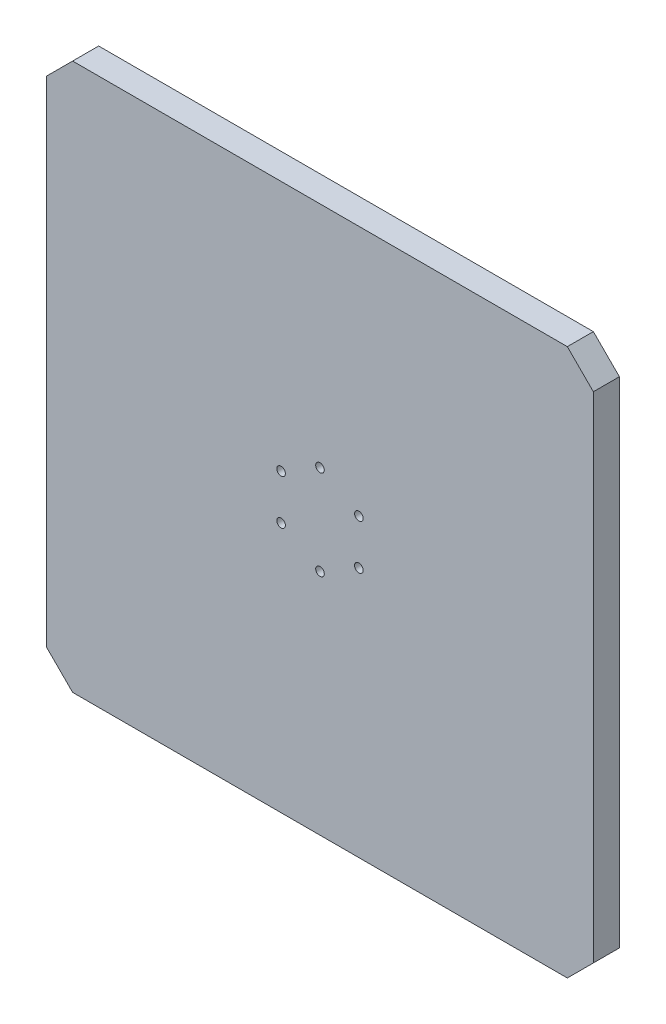
ISO-10303-21;
HEADER;
FILE_DESCRIPTION(('STEP AP214'),'2;1');
FILE_NAME('part.step','',(''),(''),'','','');
FILE_SCHEMA(('AUTOMOTIVE_DESIGN { 1 0 10303 214 1 1 1 1 }'));
ENDSEC;
DATA;
#1=APPLICATION_CONTEXT('core data for automotive mechanical design processes');
#2=APPLICATION_PROTOCOL_DEFINITION('international standard','automotive_design',2000,#1);
#3=PRODUCT_CONTEXT('',#1,'mechanical');
#4=PRODUCT('Part','Part','',(#3));
#5=PRODUCT_RELATED_PRODUCT_CATEGORY('part','',(#4));
#6=PRODUCT_DEFINITION_FORMATION('','',#4);
#7=PRODUCT_DEFINITION_CONTEXT('part definition',#1,'design');
#8=PRODUCT_DEFINITION('design','',#6,#7);
#9=PRODUCT_DEFINITION_SHAPE('','',#8);
#10=(LENGTH_UNIT() NAMED_UNIT(*) SI_UNIT(.MILLI.,.METRE.));
#11=(NAMED_UNIT(*) PLANE_ANGLE_UNIT() SI_UNIT($,.RADIAN.));
#12=(NAMED_UNIT(*) SI_UNIT($,.STERADIAN.) SOLID_ANGLE_UNIT());
#13=UNCERTAINTY_MEASURE_WITH_UNIT(LENGTH_MEASURE(1.E-05),#10,'distance_accuracy_value','');
#14=(GEOMETRIC_REPRESENTATION_CONTEXT(3) GLOBAL_UNCERTAINTY_ASSIGNED_CONTEXT((#13)) GLOBAL_UNIT_ASSIGNED_CONTEXT((#10,
#11,#12)) REPRESENTATION_CONTEXT('',''));
#15=CARTESIAN_POINT('',(0.,0.,0.));
#16=DIRECTION('',(0.,0.,1.));
#17=DIRECTION('',(1.,0.,0.));
#18=AXIS2_PLACEMENT_3D('',#15,#16,#17);
#19=CARTESIAN_POINT('',(0.,105.,0.));
#20=DIRECTION('',(0.,1.,0.));
#21=DIRECTION('',(0.,0.,1.));
#22=AXIS2_PLACEMENT_3D('',#19,#20,#21);
#23=PLANE('',#22);
#24=DIRECTION('',(0.,0.,-1.));
#25=VECTOR('',#24,1.);
#26=CARTESIAN_POINT('',(95.,105.,0.));
#27=LINE('',#26,#25);
#28=CARTESIAN_POINT('',(95.,105.,30.));
#29=VERTEX_POINT('',#28);
#30=CARTESIAN_POINT('',(95.,105.,20.));
#31=VERTEX_POINT('',#30);
#32=EDGE_CURVE('E56',#29,#31,#27,.T.);
#33=ORIENTED_EDGE('',*,*,#32,.T.);
#34=DIRECTION('',(1.,0.,0.));
#35=VECTOR('',#34,1.);
#36=CARTESIAN_POINT('',(-95.,105.,20.));
#37=LINE('',#36,#35);
#38=CARTESIAN_POINT('',(-95.,105.,20.));
#39=VERTEX_POINT('',#38);
#40=EDGE_CURVE('E63',#39,#31,#37,.T.);
#41=ORIENTED_EDGE('',*,*,#40,.F.);
#42=DIRECTION('',(0.,0.,1.));
#43=VECTOR('',#42,1.);
#44=CARTESIAN_POINT('',(-95.,105.,0.));
#45=LINE('',#44,#43);
#46=CARTESIAN_POINT('',(-95.,105.,30.));
#47=VERTEX_POINT('',#46);
#48=EDGE_CURVE('E11',#39,#47,#45,.T.);
#49=ORIENTED_EDGE('',*,*,#48,.T.);
#50=DIRECTION('',(1.,0.,0.));
#51=VECTOR('',#50,1.);
#52=CARTESIAN_POINT('',(-75.,105.,30.));
#53=LINE('',#52,#51);
#54=EDGE_CURVE('E157',#47,#29,#53,.T.);
#55=ORIENTED_EDGE('',*,*,#54,.T.);
#56=EDGE_LOOP('',(#33,#41,#49,#55));
#57=FACE_BOUND('',#56,.T.);
#58=ADVANCED_FACE('F46',(#57),#23,.T.);
#59=CARTESIAN_POINT('',(-105.,0.,0.));
#60=DIRECTION('',(-1.,0.,0.));
#61=DIRECTION('',(0.,0.,1.));
#62=AXIS2_PLACEMENT_3D('',#59,#60,#61);
#63=PLANE('',#62);
#64=DIRECTION('',(0.,0.,-1.));
#65=VECTOR('',#64,1.);
#66=CARTESIAN_POINT('',(-105.,95.0000000000001,0.));
#67=LINE('',#66,#65);
#68=CARTESIAN_POINT('',(-105.,95.,30.));
#69=VERTEX_POINT('',#68);
#70=CARTESIAN_POINT('',(-105.,95.0000000000001,20.));
#71=VERTEX_POINT('',#70);
#72=EDGE_CURVE('E150',#69,#71,#67,.T.);
#73=ORIENTED_EDGE('',*,*,#72,.T.);
#74=DIRECTION('',(0.,1.,0.));
#75=VECTOR('',#74,1.);
#76=CARTESIAN_POINT('',(-105.,-94.9999999999999,20.));
#77=LINE('',#76,#75);
#78=CARTESIAN_POINT('',(-105.,-94.9999999999999,20.));
#79=VERTEX_POINT('',#78);
#80=EDGE_CURVE('E206',#79,#71,#77,.T.);
#81=ORIENTED_EDGE('',*,*,#80,.F.);
#82=DIRECTION('',(0.,0.,1.));
#83=VECTOR('',#82,1.);
#84=CARTESIAN_POINT('',(-105.,-95.,0.));
#85=LINE('',#84,#83);
#86=CARTESIAN_POINT('',(-105.,-95.,30.));
#87=VERTEX_POINT('',#86);
#88=EDGE_CURVE('E148',#79,#87,#85,.T.);
#89=ORIENTED_EDGE('',*,*,#88,.T.);
#90=DIRECTION('',(0.,1.,0.));
#91=VECTOR('',#90,1.);
#92=CARTESIAN_POINT('',(-105.,-75.,30.));
#93=LINE('',#92,#91);
#94=EDGE_CURVE('E159',#87,#69,#93,.T.);
#95=ORIENTED_EDGE('',*,*,#94,.T.);
#96=EDGE_LOOP('',(#73,#81,#89,#95));
#97=FACE_BOUND('',#96,.T.);
#98=ADVANCED_FACE('F227',(#97),#63,.T.);
#99=CARTESIAN_POINT('',(0.,-105.,0.));
#100=DIRECTION('',(0.,-1.,0.));
#101=DIRECTION('',(0.,0.,-1.));
#102=AXIS2_PLACEMENT_3D('',#99,#100,#101);
#103=PLANE('',#102);
#104=DIRECTION('',(0.,0.,-1.));
#105=VECTOR('',#104,1.);
#106=CARTESIAN_POINT('',(-95.0000000000001,-105.,0.));
#107=LINE('',#106,#105);
#108=CARTESIAN_POINT('',(-95.,-105.,30.));
#109=VERTEX_POINT('',#108);
#110=CARTESIAN_POINT('',(-95.0000000000001,-105.,20.));
#111=VERTEX_POINT('',#110);
#112=EDGE_CURVE('E153',#109,#111,#107,.T.);
#113=ORIENTED_EDGE('',*,*,#112,.T.);
#114=DIRECTION('',(-1.,0.,0.));
#115=VECTOR('',#114,1.);
#116=CARTESIAN_POINT('',(94.9999999999999,-105.,20.));
#117=LINE('',#116,#115);
#118=CARTESIAN_POINT('',(94.9999999999999,-105.,20.));
#119=VERTEX_POINT('',#118);
#120=EDGE_CURVE('E130',#119,#111,#117,.T.);
#121=ORIENTED_EDGE('',*,*,#120,.F.);
#122=DIRECTION('',(0.,0.,1.));
#123=VECTOR('',#122,1.);
#124=CARTESIAN_POINT('',(95.,-105.,0.));
#125=LINE('',#124,#123);
#126=CARTESIAN_POINT('',(95.,-105.,30.));
#127=VERTEX_POINT('',#126);
#128=EDGE_CURVE('E129',#119,#127,#125,.T.);
#129=ORIENTED_EDGE('',*,*,#128,.T.);
#130=DIRECTION('',(-1.,0.,0.));
#131=VECTOR('',#130,1.);
#132=CARTESIAN_POINT('',(75.,-105.,30.));
#133=LINE('',#132,#131);
#134=EDGE_CURVE('E162',#127,#109,#133,.T.);
#135=ORIENTED_EDGE('',*,*,#134,.T.);
#136=EDGE_LOOP('',(#113,#121,#129,#135));
#137=FACE_BOUND('',#136,.T.);
#138=ADVANCED_FACE('F233',(#137),#103,.T.);
#139=CARTESIAN_POINT('',(105.,0.,0.));
#140=DIRECTION('',(1.,0.,0.));
#141=DIRECTION('',(0.,0.,-1.));
#142=AXIS2_PLACEMENT_3D('',#139,#140,#141);
#143=PLANE('',#142);
#144=DIRECTION('',(0.,0.,-1.));
#145=VECTOR('',#144,1.);
#146=CARTESIAN_POINT('',(105.,-95.0000000000001,0.));
#147=LINE('',#146,#145);
#148=CARTESIAN_POINT('',(105.,-95.0000000000001,30.));
#149=VERTEX_POINT('',#148);
#150=CARTESIAN_POINT('',(105.,-95.0000000000001,20.));
#151=VERTEX_POINT('',#150);
#152=EDGE_CURVE('E128',#149,#151,#147,.T.);
#153=ORIENTED_EDGE('',*,*,#152,.T.);
#154=DIRECTION('',(0.,-1.,0.));
#155=VECTOR('',#154,1.);
#156=CARTESIAN_POINT('',(105.,95.0000000000001,20.));
#157=LINE('',#156,#155);
#158=CARTESIAN_POINT('',(105.,95.0000000000001,20.));
#159=VERTEX_POINT('',#158);
#160=EDGE_CURVE('E112',#159,#151,#157,.T.);
#161=ORIENTED_EDGE('',*,*,#160,.F.);
#162=DIRECTION('',(0.,0.,1.));
#163=VECTOR('',#162,1.);
#164=CARTESIAN_POINT('',(105.,95.0000000000001,0.));
#165=LINE('',#164,#163);
#166=CARTESIAN_POINT('',(105.,95.0000000000001,30.));
#167=VERTEX_POINT('',#166);
#168=EDGE_CURVE('E135',#159,#167,#165,.T.);
#169=ORIENTED_EDGE('',*,*,#168,.T.);
#170=DIRECTION('',(0.,-1.,0.));
#171=VECTOR('',#170,1.);
#172=CARTESIAN_POINT('',(105.,105.,30.));
#173=LINE('',#172,#171);
#174=EDGE_CURVE('E134',#167,#149,#173,.T.);
#175=ORIENTED_EDGE('',*,*,#174,.T.);
#176=EDGE_LOOP('',(#153,#161,#169,#175));
#177=FACE_BOUND('',#176,.T.);
#178=ADVANCED_FACE('F133',(#177),#143,.T.);
#179=CARTESIAN_POINT('',(-95.0000000000001,-105.,0.));
#180=DIRECTION('',(0.707106781186549,0.707106781186546,0.));
#181=DIRECTION('',(0.,0.,-1.));
#182=AXIS2_PLACEMENT_3D('',#179,#180,#181);
#183=PLANE('',#182);
#184=ORIENTED_EDGE('',*,*,#88,.F.);
#185=DIRECTION('',(-0.707106781186544,0.707106781186551,0.));
#186=VECTOR('',#185,1.);
#187=CARTESIAN_POINT('',(-95.0000000000001,-105.,20.));
#188=LINE('',#187,#186);
#189=EDGE_CURVE('E208',#111,#79,#188,.T.);
#190=ORIENTED_EDGE('',*,*,#189,.F.);
#191=ORIENTED_EDGE('',*,*,#112,.F.);
#192=DIRECTION('',(-0.707106781186546,0.707106781186549,0.));
#193=VECTOR('',#192,1.);
#194=CARTESIAN_POINT('',(-95.0000000000001,-105.,30.));
#195=LINE('',#194,#193);
#196=EDGE_CURVE('E139',#87,#109,#195,.F.);
#197=ORIENTED_EDGE('',*,*,#196,.F.);
#198=EDGE_LOOP('',(#184,#190,#191,#197));
#199=FACE_BOUND('',#198,.T.);
#200=ADVANCED_FACE('F246',(#199),#183,.F.);
#201=CARTESIAN_POINT('',(105.,-95.0000000000001,0.));
#202=DIRECTION('',(-0.707106781186546,0.707106781186549,0.));
#203=DIRECTION('',(0.,0.,-1.));
#204=AXIS2_PLACEMENT_3D('',#201,#202,#203);
#205=PLANE('',#204);
#206=ORIENTED_EDGE('',*,*,#128,.F.);
#207=DIRECTION('',(-0.707106781186551,-0.707106781186544,0.));
#208=VECTOR('',#207,1.);
#209=CARTESIAN_POINT('',(105.,-95.0000000000001,20.));
#210=LINE('',#209,#208);
#211=EDGE_CURVE('E115',#151,#119,#210,.T.);
#212=ORIENTED_EDGE('',*,*,#211,.F.);
#213=ORIENTED_EDGE('',*,*,#152,.F.);
#214=DIRECTION('',(-0.707106781186549,-0.707106781186546,0.));
#215=VECTOR('',#214,1.);
#216=CARTESIAN_POINT('',(105.,-95.0000000000001,30.));
#217=LINE('',#216,#215);
#218=EDGE_CURVE('E143',#127,#149,#217,.F.);
#219=ORIENTED_EDGE('',*,*,#218,.F.);
#220=EDGE_LOOP('',(#206,#212,#213,#219));
#221=FACE_BOUND('',#220,.T.);
#222=ADVANCED_FACE('F126',(#221),#205,.F.);
#223=CARTESIAN_POINT('',(-105.,95.0000000000001,0.));
#224=DIRECTION('',(0.707106781186546,-0.707106781186549,0.));
#225=DIRECTION('',(0.,0.,-1.));
#226=AXIS2_PLACEMENT_3D('',#223,#224,#225);
#227=PLANE('',#226);
#228=ORIENTED_EDGE('',*,*,#48,.F.);
#229=DIRECTION('',(0.707106781186549,0.707106781186546,0.));
#230=VECTOR('',#229,1.);
#231=CARTESIAN_POINT('',(-105.,95.0000000000001,20.));
#232=LINE('',#231,#230);
#233=EDGE_CURVE('E204',#71,#39,#232,.T.);
#234=ORIENTED_EDGE('',*,*,#233,.F.);
#235=ORIENTED_EDGE('',*,*,#72,.F.);
#236=DIRECTION('',(0.707106781186549,0.707106781186546,0.));
#237=VECTOR('',#236,1.);
#238=CARTESIAN_POINT('',(-105.,95.0000000000001,30.));
#239=LINE('',#238,#237);
#240=EDGE_CURVE('E145',#47,#69,#239,.F.);
#241=ORIENTED_EDGE('',*,*,#240,.F.);
#242=EDGE_LOOP('',(#228,#234,#235,#241));
#243=FACE_BOUND('',#242,.T.);
#244=ADVANCED_FACE('F257',(#243),#227,.F.);
#245=CARTESIAN_POINT('',(105.,95.0000000000001,0.));
#246=DIRECTION('',(-0.707106781186546,-0.707106781186549,0.));
#247=DIRECTION('',(0.,0.,1.));
#248=AXIS2_PLACEMENT_3D('',#245,#246,#247);
#249=PLANE('',#248);
#250=ORIENTED_EDGE('',*,*,#168,.F.);
#251=DIRECTION('',(0.707106781186549,-0.707106781186546,0.));
#252=VECTOR('',#251,1.);
#253=CARTESIAN_POINT('',(95.,105.,20.));
#254=LINE('',#253,#252);
#255=EDGE_CURVE('E117',#31,#159,#254,.T.);
#256=ORIENTED_EDGE('',*,*,#255,.F.);
#257=ORIENTED_EDGE('',*,*,#32,.F.);
#258=DIRECTION('',(0.707106781186549,-0.707106781186546,0.));
#259=VECTOR('',#258,1.);
#260=CARTESIAN_POINT('',(105.,95.0000000000001,30.));
#261=LINE('',#260,#259);
#262=EDGE_CURVE('E71',#167,#29,#261,.F.);
#263=ORIENTED_EDGE('',*,*,#262,.F.);
#264=EDGE_LOOP('',(#250,#256,#257,#263));
#265=FACE_BOUND('',#264,.T.);
#266=ADVANCED_FACE('F49',(#265),#249,.F.);
#267=CARTESIAN_POINT('',(0.,0.,-10.));
#268=DIRECTION('',(0.,0.,1.));
#269=DIRECTION('',(1.,0.,0.));
#270=AXIS2_PLACEMENT_3D('',#267,#268,#269);
#271=CYLINDRICAL_SURFACE('',#270,48.25);
#272=CARTESIAN_POINT('',(0.,0.,10.));
#273=DIRECTION('',(0.,0.,-1.));
#274=DIRECTION('',(-1.,0.,0.));
#275=AXIS2_PLACEMENT_3D('',#272,#273,#274);
#276=CIRCLE('',#275,48.25);
#277=CARTESIAN_POINT('',(-48.25,0.,10.));
#278=VERTEX_POINT('',#277);
#279=EDGE_CURVE('E199',#278,#278,#276,.T.);
#280=ORIENTED_EDGE('',*,*,#279,.F.);
#281=EDGE_LOOP('',(#280));
#282=FACE_BOUND('',#281,.T.);
#283=CARTESIAN_POINT('',(0.,0.,20.));
#284=DIRECTION('',(0.,0.,-1.));
#285=DIRECTION('',(-1.,0.,0.));
#286=AXIS2_PLACEMENT_3D('',#283,#284,#285);
#287=CIRCLE('',#286,48.25);
#288=CARTESIAN_POINT('',(-48.25,0.,20.));
#289=VERTEX_POINT('',#288);
#290=EDGE_CURVE('E121',#289,#289,#287,.T.);
#291=ORIENTED_EDGE('',*,*,#290,.T.);
#292=EDGE_LOOP('',(#291));
#293=FACE_BOUND('',#292,.T.);
#294=ADVANCED_FACE('F214',(#282,#293),#271,.T.);
#295=CARTESIAN_POINT('',(14.9389382152816,-8.62499999999986,30.));
#296=DIRECTION('',(0.,0.,-1.));
#297=DIRECTION('',(-1.,0.,0.));
#298=AXIS2_PLACEMENT_3D('',#295,#296,#297);
#299=CYLINDRICAL_SURFACE('',#298,1.65);
#300=CARTESIAN_POINT('',(14.9389382152816,-8.62499999999986,30.));
#301=DIRECTION('',(0.,0.,-1.));
#302=DIRECTION('',(-1.,0.,0.));
#303=AXIS2_PLACEMENT_3D('',#300,#301,#302);
#304=CIRCLE('',#303,1.65);
#305=CARTESIAN_POINT('',(13.2889382152816,-8.62499999999986,30.));
#306=VERTEX_POINT('',#305);
#307=EDGE_CURVE('E166',#306,#306,#304,.T.);
#308=ORIENTED_EDGE('',*,*,#307,.F.);
#309=EDGE_LOOP('',(#308));
#310=FACE_BOUND('',#309,.T.);
#311=CARTESIAN_POINT('',(14.9389382152816,-8.62499999999986,10.));
#312=DIRECTION('',(0.,0.,-1.));
#313=DIRECTION('',(-1.,0.,0.));
#314=AXIS2_PLACEMENT_3D('',#311,#312,#313);
#315=CIRCLE('',#314,1.65);
#316=CARTESIAN_POINT('',(13.2889382152816,-8.62499999999986,10.));
#317=VERTEX_POINT('',#316);
#318=EDGE_CURVE('E174',#317,#317,#315,.F.);
#319=ORIENTED_EDGE('',*,*,#318,.F.);
#320=EDGE_LOOP('',(#319));
#321=FACE_BOUND('',#320,.T.);
#322=ADVANCED_FACE('F239',(#310,#321),#299,.F.);
#323=CARTESIAN_POINT('',(1.20456106190088E-13,-17.25,30.));
#324=DIRECTION('',(0.,0.,-1.));
#325=DIRECTION('',(-1.,0.,0.));
#326=AXIS2_PLACEMENT_3D('',#323,#324,#325);
#327=CYLINDRICAL_SURFACE('',#326,1.65);
#328=CARTESIAN_POINT('',(1.20456106190088E-13,-17.25,30.));
#329=DIRECTION('',(0.,0.,-1.));
#330=DIRECTION('',(-1.,0.,0.));
#331=AXIS2_PLACEMENT_3D('',#328,#329,#330);
#332=CIRCLE('',#331,1.65);
#333=CARTESIAN_POINT('',(-1.64999999999988,-17.25,30.));
#334=VERTEX_POINT('',#333);
#335=EDGE_CURVE('E169',#334,#334,#332,.T.);
#336=ORIENTED_EDGE('',*,*,#335,.F.);
#337=EDGE_LOOP('',(#336));
#338=FACE_BOUND('',#337,.T.);
#339=CARTESIAN_POINT('',(1.20456106190088E-13,-17.25,10.));
#340=DIRECTION('',(0.,0.,-1.));
#341=DIRECTION('',(-1.,0.,0.));
#342=AXIS2_PLACEMENT_3D('',#339,#340,#341);
#343=CIRCLE('',#342,1.65);
#344=CARTESIAN_POINT('',(-1.64999999999988,-17.25,10.));
#345=VERTEX_POINT('',#344);
#346=EDGE_CURVE('E187',#345,#345,#343,.F.);
#347=ORIENTED_EDGE('',*,*,#346,.F.);
#348=EDGE_LOOP('',(#347));
#349=FACE_BOUND('',#348,.T.);
#350=ADVANCED_FACE('F287',(#338,#349),#327,.F.);
#351=CARTESIAN_POINT('',(-14.9389382152815,-8.62500000000007,30.));
#352=DIRECTION('',(0.,0.,-1.));
#353=DIRECTION('',(-1.,0.,0.));
#354=AXIS2_PLACEMENT_3D('',#351,#352,#353);
#355=CYLINDRICAL_SURFACE('',#354,1.65);
#356=CARTESIAN_POINT('',(-14.9389382152815,-8.62500000000007,30.));
#357=DIRECTION('',(0.,0.,-1.));
#358=DIRECTION('',(-1.,0.,0.));
#359=AXIS2_PLACEMENT_3D('',#356,#357,#358);
#360=CIRCLE('',#359,1.65);
#361=CARTESIAN_POINT('',(-16.5889382152815,-8.62500000000007,30.));
#362=VERTEX_POINT('',#361);
#363=EDGE_CURVE('E180',#362,#362,#360,.T.);
#364=ORIENTED_EDGE('',*,*,#363,.F.);
#365=EDGE_LOOP('',(#364));
#366=FACE_BOUND('',#365,.T.);
#367=CARTESIAN_POINT('',(-14.9389382152815,-8.62500000000007,10.));
#368=DIRECTION('',(0.,0.,-1.));
#369=DIRECTION('',(-1.,0.,0.));
#370=AXIS2_PLACEMENT_3D('',#367,#368,#369);
#371=CIRCLE('',#370,1.65);
#372=CARTESIAN_POINT('',(-16.5889382152815,-8.62500000000007,10.));
#373=VERTEX_POINT('',#372);
#374=EDGE_CURVE('E190',#373,#373,#371,.F.);
#375=ORIENTED_EDGE('',*,*,#374,.F.);
#376=EDGE_LOOP('',(#375));
#377=FACE_BOUND('',#376,.T.);
#378=ADVANCED_FACE('F299',(#366,#377),#355,.F.);
#379=CARTESIAN_POINT('',(-14.9389382152816,8.62499999999997,30.));
#380=DIRECTION('',(0.,0.,-1.));
#381=DIRECTION('',(-1.,0.,0.));
#382=AXIS2_PLACEMENT_3D('',#379,#380,#381);
#383=CYLINDRICAL_SURFACE('',#382,1.65);
#384=CARTESIAN_POINT('',(-14.9389382152816,8.62499999999997,30.));
#385=DIRECTION('',(0.,0.,-1.));
#386=DIRECTION('',(-1.,0.,0.));
#387=AXIS2_PLACEMENT_3D('',#384,#385,#386);
#388=CIRCLE('',#387,1.65);
#389=CARTESIAN_POINT('',(-16.5889382152816,8.62499999999997,30.));
#390=VERTEX_POINT('',#389);
#391=EDGE_CURVE('E177',#390,#390,#388,.T.);
#392=ORIENTED_EDGE('',*,*,#391,.F.);
#393=EDGE_LOOP('',(#392));
#394=FACE_BOUND('',#393,.T.);
#395=CARTESIAN_POINT('',(-14.9389382152816,8.62499999999997,10.));
#396=DIRECTION('',(0.,0.,-1.));
#397=DIRECTION('',(-1.,0.,0.));
#398=AXIS2_PLACEMENT_3D('',#395,#396,#397);
#399=CIRCLE('',#398,1.65);
#400=CARTESIAN_POINT('',(-16.5889382152816,8.62499999999997,10.));
#401=VERTEX_POINT('',#400);
#402=EDGE_CURVE('E193',#401,#401,#399,.F.);
#403=ORIENTED_EDGE('',*,*,#402,.F.);
#404=EDGE_LOOP('',(#403));
#405=FACE_BOUND('',#404,.T.);
#406=ADVANCED_FACE('F295',(#394,#405),#383,.F.);
#407=CARTESIAN_POINT('',(0.,17.25,30.));
#408=DIRECTION('',(0.,0.,-1.));
#409=DIRECTION('',(-1.,0.,0.));
#410=AXIS2_PLACEMENT_3D('',#407,#408,#409);
#411=CYLINDRICAL_SURFACE('',#410,1.65);
#412=CARTESIAN_POINT('',(0.,17.25,30.));
#413=DIRECTION('',(0.,0.,-1.));
#414=DIRECTION('',(-1.,0.,0.));
#415=AXIS2_PLACEMENT_3D('',#412,#413,#414);
#416=CIRCLE('',#415,1.65);
#417=CARTESIAN_POINT('',(-1.65,17.25,30.));
#418=VERTEX_POINT('',#417);
#419=EDGE_CURVE('E173',#418,#418,#416,.T.);
#420=ORIENTED_EDGE('',*,*,#419,.F.);
#421=EDGE_LOOP('',(#420));
#422=FACE_BOUND('',#421,.T.);
#423=CARTESIAN_POINT('',(0.,17.25,10.));
#424=DIRECTION('',(0.,0.,-1.));
#425=DIRECTION('',(-1.,0.,0.));
#426=AXIS2_PLACEMENT_3D('',#423,#424,#425);
#427=CIRCLE('',#426,1.65);
#428=CARTESIAN_POINT('',(-1.65,17.25,10.));
#429=VERTEX_POINT('',#428);
#430=EDGE_CURVE('E196',#429,#429,#427,.F.);
#431=ORIENTED_EDGE('',*,*,#430,.F.);
#432=EDGE_LOOP('',(#431));
#433=FACE_BOUND('',#432,.T.);
#434=ADVANCED_FACE('F291',(#422,#433),#411,.F.);
#435=CARTESIAN_POINT('',(14.9389382152815,8.62500000000018,30.));
#436=DIRECTION('',(0.,0.,-1.));
#437=DIRECTION('',(-1.,0.,0.));
#438=AXIS2_PLACEMENT_3D('',#435,#436,#437);
#439=CYLINDRICAL_SURFACE('',#438,1.65);
#440=CARTESIAN_POINT('',(14.9389382152815,8.62500000000018,30.));
#441=DIRECTION('',(0.,0.,-1.));
#442=DIRECTION('',(-1.,0.,0.));
#443=AXIS2_PLACEMENT_3D('',#440,#441,#442);
#444=CIRCLE('',#443,1.65);
#445=CARTESIAN_POINT('',(13.2889382152815,8.62500000000018,30.));
#446=VERTEX_POINT('',#445);
#447=EDGE_CURVE('E170',#446,#446,#444,.T.);
#448=ORIENTED_EDGE('',*,*,#447,.F.);
#449=EDGE_LOOP('',(#448));
#450=FACE_BOUND('',#449,.T.);
#451=CARTESIAN_POINT('',(14.9389382152815,8.62500000000018,10.));
#452=DIRECTION('',(0.,0.,-1.));
#453=DIRECTION('',(-1.,0.,0.));
#454=AXIS2_PLACEMENT_3D('',#451,#452,#453);
#455=CIRCLE('',#454,1.65);
#456=CARTESIAN_POINT('',(13.2889382152815,8.62500000000018,10.));
#457=VERTEX_POINT('',#456);
#458=EDGE_CURVE('E51',#457,#457,#455,.F.);
#459=ORIENTED_EDGE('',*,*,#458,.F.);
#460=EDGE_LOOP('',(#459));
#461=FACE_BOUND('',#460,.T.);
#462=ADVANCED_FACE('F243',(#450,#461),#439,.F.);
#463=CARTESIAN_POINT('',(0.,0.,30.));
#464=DIRECTION('',(0.,0.,-1.));
#465=DIRECTION('',(-1.,0.,0.));
#466=AXIS2_PLACEMENT_3D('',#463,#464,#465);
#467=PLANE('',#466);
#468=ORIENTED_EDGE('',*,*,#447,.T.);
#469=EDGE_LOOP('',(#468));
#470=FACE_BOUND('',#469,.T.);
#471=ORIENTED_EDGE('',*,*,#419,.T.);
#472=EDGE_LOOP('',(#471));
#473=FACE_BOUND('',#472,.T.);
#474=ORIENTED_EDGE('',*,*,#391,.T.);
#475=EDGE_LOOP('',(#474));
#476=FACE_BOUND('',#475,.T.);
#477=ORIENTED_EDGE('',*,*,#363,.T.);
#478=EDGE_LOOP('',(#477));
#479=FACE_BOUND('',#478,.T.);
#480=ORIENTED_EDGE('',*,*,#335,.T.);
#481=EDGE_LOOP('',(#480));
#482=FACE_BOUND('',#481,.T.);
#483=ORIENTED_EDGE('',*,*,#307,.T.);
#484=EDGE_LOOP('',(#483));
#485=FACE_BOUND('',#484,.T.);
#486=ORIENTED_EDGE('',*,*,#94,.F.);
#487=ORIENTED_EDGE('',*,*,#196,.T.);
#488=ORIENTED_EDGE('',*,*,#134,.F.);
#489=ORIENTED_EDGE('',*,*,#218,.T.);
#490=ORIENTED_EDGE('',*,*,#174,.F.);
#491=ORIENTED_EDGE('',*,*,#262,.T.);
#492=ORIENTED_EDGE('',*,*,#54,.F.);
#493=ORIENTED_EDGE('',*,*,#240,.T.);
#494=EDGE_LOOP('',(#486,#487,#488,#489,#490,#491,#492,#493));
#495=FACE_BOUND('',#494,.T.);
#496=ADVANCED_FACE('F223',(#470,#473,#476,#479,#482,#485,#495),#467,.F.);
#497=CARTESIAN_POINT('',(0.,0.,10.));
#498=DIRECTION('',(0.,0.,-1.));
#499=DIRECTION('',(-1.,0.,0.));
#500=AXIS2_PLACEMENT_3D('',#497,#498,#499);
#501=PLANE('',#500);
#502=ORIENTED_EDGE('',*,*,#279,.T.);
#503=EDGE_LOOP('',(#502));
#504=FACE_BOUND('',#503,.T.);
#505=ORIENTED_EDGE('',*,*,#458,.T.);
#506=EDGE_LOOP('',(#505));
#507=FACE_BOUND('',#506,.T.);
#508=ORIENTED_EDGE('',*,*,#430,.T.);
#509=EDGE_LOOP('',(#508));
#510=FACE_BOUND('',#509,.T.);
#511=ORIENTED_EDGE('',*,*,#402,.T.);
#512=EDGE_LOOP('',(#511));
#513=FACE_BOUND('',#512,.T.);
#514=ORIENTED_EDGE('',*,*,#374,.T.);
#515=EDGE_LOOP('',(#514));
#516=FACE_BOUND('',#515,.T.);
#517=ORIENTED_EDGE('',*,*,#346,.T.);
#518=EDGE_LOOP('',(#517));
#519=FACE_BOUND('',#518,.T.);
#520=ORIENTED_EDGE('',*,*,#318,.T.);
#521=EDGE_LOOP('',(#520));
#522=FACE_BOUND('',#521,.T.);
#523=ADVANCED_FACE('F217',(#504,#507,#510,#513,#516,#519,#522),#501,.T.);
#524=CARTESIAN_POINT('',(0.,0.,20.));
#525=DIRECTION('',(0.,0.,-1.));
#526=DIRECTION('',(-1.,0.,0.));
#527=AXIS2_PLACEMENT_3D('',#524,#525,#526);
#528=PLANE('',#527);
#529=ORIENTED_EDGE('',*,*,#290,.F.);
#530=EDGE_LOOP('',(#529));
#531=FACE_BOUND('',#530,.T.);
#532=ORIENTED_EDGE('',*,*,#160,.T.);
#533=ORIENTED_EDGE('',*,*,#211,.T.);
#534=ORIENTED_EDGE('',*,*,#120,.T.);
#535=ORIENTED_EDGE('',*,*,#189,.T.);
#536=ORIENTED_EDGE('',*,*,#80,.T.);
#537=ORIENTED_EDGE('',*,*,#233,.T.);
#538=ORIENTED_EDGE('',*,*,#40,.T.);
#539=ORIENTED_EDGE('',*,*,#255,.T.);
#540=EDGE_LOOP('',(#532,#533,#534,#535,#536,#537,#538,#539));
#541=FACE_BOUND('',#540,.T.);
#542=ADVANCED_FACE('F114',(#531,#541),#528,.T.);
#543=CLOSED_SHELL('',(#58,#98,#138,#178,#200,#222,#244,#266,#294,#322,#350,#378,#406,#434,#462,
#496,#523,#542));
#544=MANIFOLD_SOLID_BREP('B2',#543);
#545=ADVANCED_BREP_SHAPE_REPRESENTATION('',(#18,#544),#14);
#546=SHAPE_DEFINITION_REPRESENTATION(#9,#545);
ENDSEC;
END-ISO-10303-21;
